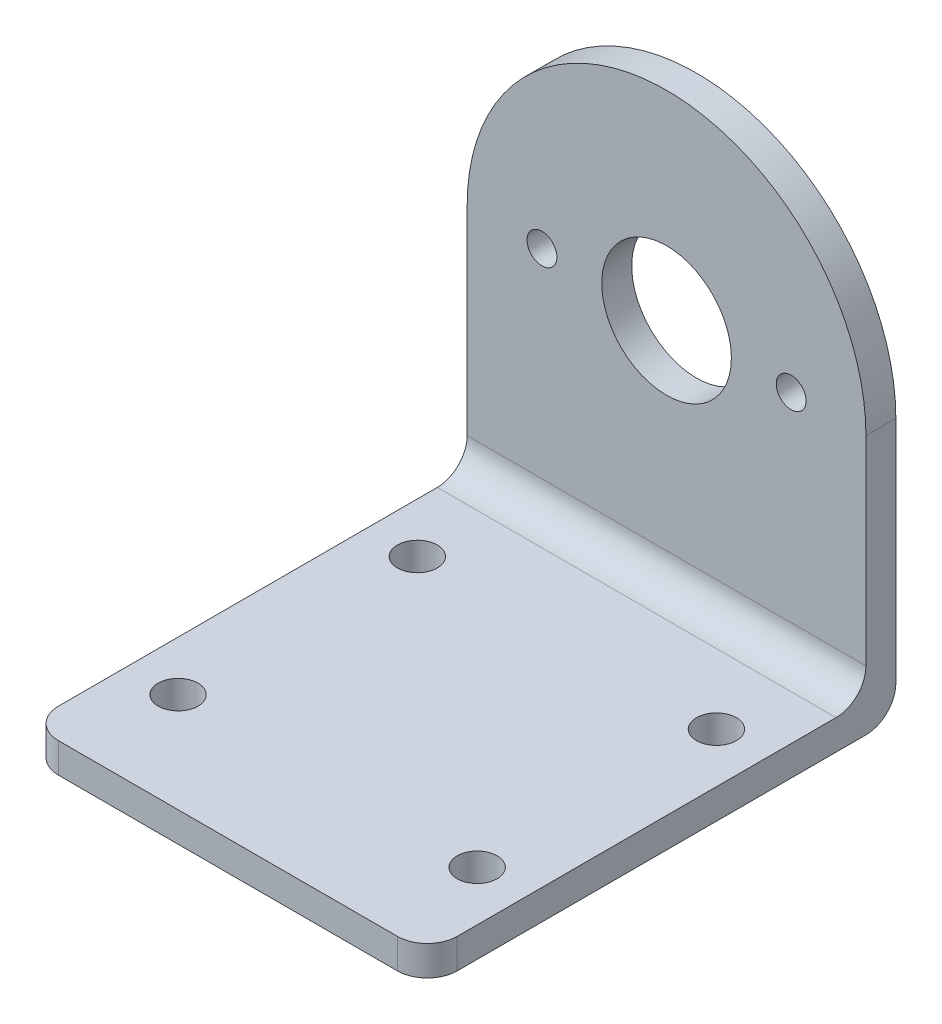
ISO-10303-21;
HEADER;
FILE_DESCRIPTION(('STEP AP214'),'2;1');
FILE_NAME('part.step','',(''),(''),'','','');
FILE_SCHEMA(('AUTOMOTIVE_DESIGN { 1 0 10303 214 1 1 1 1 }'));
ENDSEC;
DATA;
#1=APPLICATION_CONTEXT('core data for automotive mechanical design processes');
#2=APPLICATION_PROTOCOL_DEFINITION('international standard','automotive_design',2000,#1);
#3=PRODUCT_CONTEXT('',#1,'mechanical');
#4=PRODUCT('Part','Part','',(#3));
#5=PRODUCT_RELATED_PRODUCT_CATEGORY('part','',(#4));
#6=PRODUCT_DEFINITION_FORMATION('','',#4);
#7=PRODUCT_DEFINITION_CONTEXT('part definition',#1,'design');
#8=PRODUCT_DEFINITION('design','',#6,#7);
#9=PRODUCT_DEFINITION_SHAPE('','',#8);
#10=(LENGTH_UNIT() NAMED_UNIT(*) SI_UNIT(.MILLI.,.METRE.));
#11=(NAMED_UNIT(*) PLANE_ANGLE_UNIT() SI_UNIT($,.RADIAN.));
#12=(NAMED_UNIT(*) SI_UNIT($,.STERADIAN.) SOLID_ANGLE_UNIT());
#13=UNCERTAINTY_MEASURE_WITH_UNIT(LENGTH_MEASURE(1.E-05),#10,'distance_accuracy_value','');
#14=(GEOMETRIC_REPRESENTATION_CONTEXT(3) GLOBAL_UNCERTAINTY_ASSIGNED_CONTEXT((#13)) GLOBAL_UNIT_ASSIGNED_CONTEXT((#10,
#11,#12)) REPRESENTATION_CONTEXT('',''));
#15=CARTESIAN_POINT('',(0.,0.,0.));
#16=DIRECTION('',(0.,0.,1.));
#17=DIRECTION('',(1.,0.,0.));
#18=AXIS2_PLACEMENT_3D('',#15,#16,#17);
#19=CARTESIAN_POINT('',(20.,26.,3.));
#20=DIRECTION('',(0.,0.,1.));
#21=DIRECTION('',(1.,0.,0.));
#22=AXIS2_PLACEMENT_3D('',#19,#20,#21);
#23=PLANE('',#22);
#24=DIRECTION('',(0.,-1.,0.));
#25=VECTOR('',#24,1.);
#26=CARTESIAN_POINT('',(0.,0.,3.));
#27=LINE('',#26,#25);
#28=CARTESIAN_POINT('',(0.,26.,3.));
#29=VERTEX_POINT('',#28);
#30=CARTESIAN_POINT('',(0.,6.,3.));
#31=VERTEX_POINT('',#30);
#32=EDGE_CURVE('E122',#29,#31,#27,.T.);
#33=ORIENTED_EDGE('',*,*,#32,.T.);
#34=DIRECTION('',(-1.,0.,0.));
#35=VECTOR('',#34,1.);
#36=CARTESIAN_POINT('',(20.,6.,3.));
#37=LINE('',#36,#35);
#38=CARTESIAN_POINT('',(40.,6.,3.));
#39=VERTEX_POINT('',#38);
#40=EDGE_CURVE('E119',#31,#39,#37,.F.);
#41=ORIENTED_EDGE('',*,*,#40,.T.);
#42=DIRECTION('',(0.,1.,0.));
#43=VECTOR('',#42,1.);
#44=CARTESIAN_POINT('',(40.,0.,3.));
#45=LINE('',#44,#43);
#46=CARTESIAN_POINT('',(40.,26.,3.));
#47=VERTEX_POINT('',#46);
#48=EDGE_CURVE('E111',#39,#47,#45,.T.);
#49=ORIENTED_EDGE('',*,*,#48,.T.);
#50=CARTESIAN_POINT('',(20.,26.,3.));
#51=DIRECTION('',(0.,0.,1.));
#52=DIRECTION('',(1.,0.,0.));
#53=AXIS2_PLACEMENT_3D('',#50,#51,#52);
#54=CIRCLE('',#53,20.);
#55=EDGE_CURVE('E116',#47,#29,#54,.T.);
#56=ORIENTED_EDGE('',*,*,#55,.T.);
#57=EDGE_LOOP('',(#33,#41,#49,#56));
#58=FACE_BOUND('',#57,.T.);
#59=CARTESIAN_POINT('',(32.5,26.,3.));
#60=DIRECTION('',(0.,0.,1.));
#61=DIRECTION('',(1.,0.,0.));
#62=AXIS2_PLACEMENT_3D('',#59,#60,#61);
#63=CIRCLE('',#62,1.5);
#64=CARTESIAN_POINT('',(34.,26.,3.));
#65=VERTEX_POINT('',#64);
#66=EDGE_CURVE('E162',#65,#65,#63,.T.);
#67=ORIENTED_EDGE('',*,*,#66,.F.);
#68=EDGE_LOOP('',(#67));
#69=FACE_BOUND('',#68,.T.);
#70=CARTESIAN_POINT('',(20.,26.,3.));
#71=DIRECTION('',(0.,0.,1.));
#72=DIRECTION('',(1.,0.,0.));
#73=AXIS2_PLACEMENT_3D('',#70,#71,#72);
#74=CIRCLE('',#73,6.50000000000001);
#75=CARTESIAN_POINT('',(26.5,26.,3.));
#76=VERTEX_POINT('',#75);
#77=EDGE_CURVE('E146',#76,#76,#74,.T.);
#78=ORIENTED_EDGE('',*,*,#77,.F.);
#79=EDGE_LOOP('',(#78));
#80=FACE_BOUND('',#79,.T.);
#81=CARTESIAN_POINT('',(7.5,26.,3.));
#82=DIRECTION('',(0.,0.,1.));
#83=DIRECTION('',(1.,0.,0.));
#84=AXIS2_PLACEMENT_3D('',#81,#82,#83);
#85=CIRCLE('',#84,1.5);
#86=CARTESIAN_POINT('',(9.,26.,3.));
#87=VERTEX_POINT('',#86);
#88=EDGE_CURVE('E168',#87,#87,#85,.T.);
#89=ORIENTED_EDGE('',*,*,#88,.F.);
#90=EDGE_LOOP('',(#89));
#91=FACE_BOUND('',#90,.T.);
#92=ADVANCED_FACE('F35',(#58,#69,#80,#91),#23,.T.);
#93=CARTESIAN_POINT('',(20.,26.,0.));
#94=DIRECTION('',(0.,0.,1.));
#95=DIRECTION('',(1.,0.,0.));
#96=AXIS2_PLACEMENT_3D('',#93,#94,#95);
#97=PLANE('',#96);
#98=DIRECTION('',(0.,1.,0.));
#99=VECTOR('',#98,1.);
#100=CARTESIAN_POINT('',(40.,0.,0.));
#101=LINE('',#100,#99);
#102=CARTESIAN_POINT('',(40.,3.,0.));
#103=VERTEX_POINT('',#102);
#104=CARTESIAN_POINT('',(40.,26.,0.));
#105=VERTEX_POINT('',#104);
#106=EDGE_CURVE('E128',#103,#105,#101,.T.);
#107=ORIENTED_EDGE('',*,*,#106,.F.);
#108=DIRECTION('',(1.,0.,0.));
#109=VECTOR('',#108,1.);
#110=CARTESIAN_POINT('',(20.,3.,0.));
#111=LINE('',#110,#109);
#112=CARTESIAN_POINT('',(0.,3.,0.));
#113=VERTEX_POINT('',#112);
#114=EDGE_CURVE('E232',#103,#113,#111,.F.);
#115=ORIENTED_EDGE('',*,*,#114,.T.);
#116=DIRECTION('',(0.,-1.,0.));
#117=VECTOR('',#116,1.);
#118=CARTESIAN_POINT('',(0.,0.,0.));
#119=LINE('',#118,#117);
#120=CARTESIAN_POINT('',(0.,26.,0.));
#121=VERTEX_POINT('',#120);
#122=EDGE_CURVE('E143',#121,#113,#119,.T.);
#123=ORIENTED_EDGE('',*,*,#122,.F.);
#124=CARTESIAN_POINT('',(20.,26.,0.));
#125=DIRECTION('',(0.,0.,1.));
#126=DIRECTION('',(1.,0.,0.));
#127=AXIS2_PLACEMENT_3D('',#124,#125,#126);
#128=CIRCLE('',#127,20.);
#129=EDGE_CURVE('E148',#105,#121,#128,.T.);
#130=ORIENTED_EDGE('',*,*,#129,.F.);
#131=EDGE_LOOP('',(#107,#115,#123,#130));
#132=FACE_BOUND('',#131,.T.);
#133=CARTESIAN_POINT('',(20.,26.,0.));
#134=DIRECTION('',(0.,0.,1.));
#135=DIRECTION('',(1.,0.,0.));
#136=AXIS2_PLACEMENT_3D('',#133,#134,#135);
#137=CIRCLE('',#136,6.50000000000001);
#138=CARTESIAN_POINT('',(26.5,26.,0.));
#139=VERTEX_POINT('',#138);
#140=EDGE_CURVE('E159',#139,#139,#137,.T.);
#141=ORIENTED_EDGE('',*,*,#140,.T.);
#142=EDGE_LOOP('',(#141));
#143=FACE_BOUND('',#142,.T.);
#144=CARTESIAN_POINT('',(32.5,26.,0.));
#145=DIRECTION('',(0.,0.,1.));
#146=DIRECTION('',(1.,0.,0.));
#147=AXIS2_PLACEMENT_3D('',#144,#145,#146);
#148=CIRCLE('',#147,1.5);
#149=CARTESIAN_POINT('',(34.,26.,0.));
#150=VERTEX_POINT('',#149);
#151=EDGE_CURVE('E165',#150,#150,#148,.T.);
#152=ORIENTED_EDGE('',*,*,#151,.T.);
#153=EDGE_LOOP('',(#152));
#154=FACE_BOUND('',#153,.T.);
#155=CARTESIAN_POINT('',(7.5,26.,0.));
#156=DIRECTION('',(0.,0.,1.));
#157=DIRECTION('',(1.,0.,0.));
#158=AXIS2_PLACEMENT_3D('',#155,#156,#157);
#159=CIRCLE('',#158,1.5);
#160=CARTESIAN_POINT('',(9.,26.,0.));
#161=VERTEX_POINT('',#160);
#162=EDGE_CURVE('E171',#161,#161,#159,.T.);
#163=ORIENTED_EDGE('',*,*,#162,.T.);
#164=EDGE_LOOP('',(#163));
#165=FACE_BOUND('',#164,.T.);
#166=ADVANCED_FACE('F260',(#132,#143,#154,#165),#97,.F.);
#167=CARTESIAN_POINT('',(0.,0.,3.));
#168=DIRECTION('',(1.,0.,0.));
#169=DIRECTION('',(0.,0.,-1.));
#170=AXIS2_PLACEMENT_3D('',#167,#168,#169);
#171=PLANE('',#170);
#172=DIRECTION('',(0.,0.,-1.));
#173=VECTOR('',#172,1.);
#174=CARTESIAN_POINT('',(0.,0.,3.));
#175=LINE('',#174,#173);
#176=CARTESIAN_POINT('',(0.,0.,44.));
#177=VERTEX_POINT('',#176);
#178=CARTESIAN_POINT('',(0.,0.,3.));
#179=VERTEX_POINT('',#178);
#180=EDGE_CURVE('E151',#177,#179,#175,.T.);
#181=ORIENTED_EDGE('',*,*,#180,.F.);
#182=DIRECTION('',(0.,-1.,0.));
#183=VECTOR('',#182,1.);
#184=CARTESIAN_POINT('',(0.,0.,44.));
#185=LINE('',#184,#183);
#186=CARTESIAN_POINT('',(0.,3.,44.));
#187=VERTEX_POINT('',#186);
#188=EDGE_CURVE('E11',#177,#187,#185,.F.);
#189=ORIENTED_EDGE('',*,*,#188,.T.);
#190=DIRECTION('',(0.,0.,-1.));
#191=VECTOR('',#190,1.);
#192=CARTESIAN_POINT('',(0.,3.,47.));
#193=LINE('',#192,#191);
#194=CARTESIAN_POINT('',(0.,3.,6.));
#195=VERTEX_POINT('',#194);
#196=EDGE_CURVE('E180',#187,#195,#193,.T.);
#197=ORIENTED_EDGE('',*,*,#196,.T.);
#198=CARTESIAN_POINT('',(0.,6.,6.));
#199=DIRECTION('',(1.,0.,0.));
#200=DIRECTION('',(0.,0.,-1.));
#201=AXIS2_PLACEMENT_3D('',#198,#199,#200);
#202=CIRCLE('',#201,3.);
#203=EDGE_CURVE('E213',#195,#31,#202,.T.);
#204=ORIENTED_EDGE('',*,*,#203,.T.);
#205=ORIENTED_EDGE('',*,*,#32,.F.);
#206=DIRECTION('',(0.,0.,-1.));
#207=VECTOR('',#206,1.);
#208=CARTESIAN_POINT('',(0.,26.,3.));
#209=LINE('',#208,#207);
#210=EDGE_CURVE('E132',#29,#121,#209,.T.);
#211=ORIENTED_EDGE('',*,*,#210,.T.);
#212=ORIENTED_EDGE('',*,*,#122,.T.);
#213=CARTESIAN_POINT('',(0.,3.,3.));
#214=DIRECTION('',(1.,0.,0.));
#215=DIRECTION('',(0.,0.,-1.));
#216=AXIS2_PLACEMENT_3D('',#213,#214,#215);
#217=CIRCLE('',#216,3.);
#218=EDGE_CURVE('E210',#113,#179,#217,.F.);
#219=ORIENTED_EDGE('',*,*,#218,.T.);
#220=EDGE_LOOP('',(#181,#189,#197,#204,#205,#211,#212,#219));
#221=FACE_BOUND('',#220,.T.);
#222=ADVANCED_FACE('F265',(#221),#171,.F.);
#223=CARTESIAN_POINT('',(0.,0.,3.));
#224=DIRECTION('',(0.,1.,0.));
#225=DIRECTION('',(0.,0.,1.));
#226=AXIS2_PLACEMENT_3D('',#223,#224,#225);
#227=PLANE('',#226);
#228=CARTESIAN_POINT('',(35.,0.,13.));
#229=DIRECTION('',(0.,-1.,0.));
#230=DIRECTION('',(0.,0.,-1.));
#231=AXIS2_PLACEMENT_3D('',#228,#229,#230);
#232=CIRCLE('',#231,2.);
#233=CARTESIAN_POINT('',(35.,0.,11.));
#234=VERTEX_POINT('',#233);
#235=EDGE_CURVE('E197',#234,#234,#232,.T.);
#236=ORIENTED_EDGE('',*,*,#235,.F.);
#237=EDGE_LOOP('',(#236));
#238=FACE_BOUND('',#237,.T.);
#239=CARTESIAN_POINT('',(5.,0.,13.));
#240=DIRECTION('',(0.,-1.,0.));
#241=DIRECTION('',(0.,0.,-1.));
#242=AXIS2_PLACEMENT_3D('',#239,#240,#241);
#243=CIRCLE('',#242,2.);
#244=CARTESIAN_POINT('',(5.,0.,11.));
#245=VERTEX_POINT('',#244);
#246=EDGE_CURVE('E193',#245,#245,#243,.T.);
#247=ORIENTED_EDGE('',*,*,#246,.F.);
#248=EDGE_LOOP('',(#247));
#249=FACE_BOUND('',#248,.T.);
#250=CARTESIAN_POINT('',(35.,0.,37.));
#251=DIRECTION('',(0.,-1.,0.));
#252=DIRECTION('',(0.,0.,-1.));
#253=AXIS2_PLACEMENT_3D('',#250,#251,#252);
#254=CIRCLE('',#253,2.);
#255=CARTESIAN_POINT('',(35.,0.,35.));
#256=VERTEX_POINT('',#255);
#257=EDGE_CURVE('E189',#256,#256,#254,.T.);
#258=ORIENTED_EDGE('',*,*,#257,.F.);
#259=EDGE_LOOP('',(#258));
#260=FACE_BOUND('',#259,.T.);
#261=CARTESIAN_POINT('',(4.99999999999999,0.,37.));
#262=DIRECTION('',(0.,-1.,0.));
#263=DIRECTION('',(0.,0.,-1.));
#264=AXIS2_PLACEMENT_3D('',#261,#262,#263);
#265=CIRCLE('',#264,2.);
#266=CARTESIAN_POINT('',(4.99999999999999,0.,35.));
#267=VERTEX_POINT('',#266);
#268=EDGE_CURVE('E185',#267,#267,#265,.T.);
#269=ORIENTED_EDGE('',*,*,#268,.F.);
#270=EDGE_LOOP('',(#269));
#271=FACE_BOUND('',#270,.T.);
#272=DIRECTION('',(0.,0.,-1.));
#273=VECTOR('',#272,1.);
#274=CARTESIAN_POINT('',(40.,0.,3.));
#275=LINE('',#274,#273);
#276=CARTESIAN_POINT('',(40.,0.,44.));
#277=VERTEX_POINT('',#276);
#278=CARTESIAN_POINT('',(40.,0.,3.));
#279=VERTEX_POINT('',#278);
#280=EDGE_CURVE('E131',#277,#279,#275,.T.);
#281=ORIENTED_EDGE('',*,*,#280,.F.);
#282=CARTESIAN_POINT('',(37.,0.,44.));
#283=DIRECTION('',(0.,1.,0.));
#284=DIRECTION('',(0.,0.,1.));
#285=AXIS2_PLACEMENT_3D('',#282,#283,#284);
#286=CIRCLE('',#285,3.);
#287=CARTESIAN_POINT('',(37.,0.,47.));
#288=VERTEX_POINT('',#287);
#289=EDGE_CURVE('E43',#277,#288,#286,.F.);
#290=ORIENTED_EDGE('',*,*,#289,.T.);
#291=DIRECTION('',(1.,0.,0.));
#292=VECTOR('',#291,1.);
#293=CARTESIAN_POINT('',(0.,0.,47.));
#294=LINE('',#293,#292);
#295=CARTESIAN_POINT('',(3.,0.,47.));
#296=VERTEX_POINT('',#295);
#297=EDGE_CURVE('E181',#296,#288,#294,.T.);
#298=ORIENTED_EDGE('',*,*,#297,.F.);
#299=CARTESIAN_POINT('',(3.,0.,44.));
#300=DIRECTION('',(0.,1.,0.));
#301=DIRECTION('',(0.,0.,1.));
#302=AXIS2_PLACEMENT_3D('',#299,#300,#301);
#303=CIRCLE('',#302,3.);
#304=EDGE_CURVE('E50',#296,#177,#303,.F.);
#305=ORIENTED_EDGE('',*,*,#304,.T.);
#306=ORIENTED_EDGE('',*,*,#180,.T.);
#307=DIRECTION('',(1.,0.,0.));
#308=VECTOR('',#307,1.);
#309=CARTESIAN_POINT('',(0.,0.,3.));
#310=LINE('',#309,#308);
#311=EDGE_CURVE('E153',#179,#279,#310,.T.);
#312=ORIENTED_EDGE('',*,*,#311,.T.);
#313=EDGE_LOOP('',(#281,#290,#298,#305,#306,#312));
#314=FACE_BOUND('',#313,.T.);
#315=ADVANCED_FACE('F276',(#238,#249,#260,#271,#314),#227,.F.);
#316=CARTESIAN_POINT('',(40.,0.,3.));
#317=DIRECTION('',(-1.,0.,0.));
#318=DIRECTION('',(0.,0.,1.));
#319=AXIS2_PLACEMENT_3D('',#316,#317,#318);
#320=PLANE('',#319);
#321=DIRECTION('',(0.,0.,-1.));
#322=VECTOR('',#321,1.);
#323=CARTESIAN_POINT('',(40.,3.,47.));
#324=LINE('',#323,#322);
#325=CARTESIAN_POINT('',(40.,3.,44.));
#326=VERTEX_POINT('',#325);
#327=CARTESIAN_POINT('',(40.,3.,6.));
#328=VERTEX_POINT('',#327);
#329=EDGE_CURVE('E174',#326,#328,#324,.T.);
#330=ORIENTED_EDGE('',*,*,#329,.F.);
#331=DIRECTION('',(0.,1.,0.));
#332=VECTOR('',#331,1.);
#333=CARTESIAN_POINT('',(40.,0.,44.));
#334=LINE('',#333,#332);
#335=EDGE_CURVE('E58',#326,#277,#334,.F.);
#336=ORIENTED_EDGE('',*,*,#335,.T.);
#337=ORIENTED_EDGE('',*,*,#280,.T.);
#338=CARTESIAN_POINT('',(40.,3.,3.));
#339=DIRECTION('',(-1.,0.,0.));
#340=DIRECTION('',(0.,0.,1.));
#341=AXIS2_PLACEMENT_3D('',#338,#339,#340);
#342=CIRCLE('',#341,3.);
#343=EDGE_CURVE('E230',#279,#103,#342,.F.);
#344=ORIENTED_EDGE('',*,*,#343,.T.);
#345=ORIENTED_EDGE('',*,*,#106,.T.);
#346=DIRECTION('',(0.,0.,-1.));
#347=VECTOR('',#346,1.);
#348=CARTESIAN_POINT('',(40.,26.,3.));
#349=LINE('',#348,#347);
#350=EDGE_CURVE('E125',#47,#105,#349,.T.);
#351=ORIENTED_EDGE('',*,*,#350,.F.);
#352=ORIENTED_EDGE('',*,*,#48,.F.);
#353=CARTESIAN_POINT('',(40.,6.,6.));
#354=DIRECTION('',(-1.,0.,0.));
#355=DIRECTION('',(0.,0.,1.));
#356=AXIS2_PLACEMENT_3D('',#353,#354,#355);
#357=CIRCLE('',#356,3.);
#358=EDGE_CURVE('E215',#39,#328,#357,.T.);
#359=ORIENTED_EDGE('',*,*,#358,.T.);
#360=EDGE_LOOP('',(#330,#336,#337,#344,#345,#351,#352,#359));
#361=FACE_BOUND('',#360,.T.);
#362=ADVANCED_FACE('F126',(#361),#320,.F.);
#363=CARTESIAN_POINT('',(20.,26.,3.));
#364=DIRECTION('',(0.,0.,-1.));
#365=DIRECTION('',(-1.,0.,0.));
#366=AXIS2_PLACEMENT_3D('',#363,#364,#365);
#367=CYLINDRICAL_SURFACE('',#366,20.);
#368=ORIENTED_EDGE('',*,*,#129,.T.);
#369=ORIENTED_EDGE('',*,*,#210,.F.);
#370=ORIENTED_EDGE('',*,*,#55,.F.);
#371=ORIENTED_EDGE('',*,*,#350,.T.);
#372=EDGE_LOOP('',(#368,#369,#370,#371));
#373=FACE_BOUND('',#372,.T.);
#374=ADVANCED_FACE('F134',(#373),#367,.T.);
#375=CARTESIAN_POINT('',(20.,26.,3.));
#376=DIRECTION('',(0.,0.,-1.));
#377=DIRECTION('',(-1.,0.,0.));
#378=AXIS2_PLACEMENT_3D('',#375,#376,#377);
#379=CYLINDRICAL_SURFACE('',#378,6.50000000000001);
#380=ORIENTED_EDGE('',*,*,#77,.T.);
#381=EDGE_LOOP('',(#380));
#382=FACE_BOUND('',#381,.T.);
#383=ORIENTED_EDGE('',*,*,#140,.F.);
#384=EDGE_LOOP('',(#383));
#385=FACE_BOUND('',#384,.T.);
#386=ADVANCED_FACE('F269',(#382,#385),#379,.F.);
#387=CARTESIAN_POINT('',(32.5,26.,3.));
#388=DIRECTION('',(0.,0.,-1.));
#389=DIRECTION('',(-1.,0.,0.));
#390=AXIS2_PLACEMENT_3D('',#387,#388,#389);
#391=CYLINDRICAL_SURFACE('',#390,1.5);
#392=ORIENTED_EDGE('',*,*,#66,.T.);
#393=EDGE_LOOP('',(#392));
#394=FACE_BOUND('',#393,.T.);
#395=ORIENTED_EDGE('',*,*,#151,.F.);
#396=EDGE_LOOP('',(#395));
#397=FACE_BOUND('',#396,.T.);
#398=ADVANCED_FACE('F326',(#394,#397),#391,.F.);
#399=CARTESIAN_POINT('',(7.5,26.,3.));
#400=DIRECTION('',(0.,0.,-1.));
#401=DIRECTION('',(-1.,0.,0.));
#402=AXIS2_PLACEMENT_3D('',#399,#400,#401);
#403=CYLINDRICAL_SURFACE('',#402,1.5);
#404=ORIENTED_EDGE('',*,*,#88,.T.);
#405=EDGE_LOOP('',(#404));
#406=FACE_BOUND('',#405,.T.);
#407=ORIENTED_EDGE('',*,*,#162,.F.);
#408=EDGE_LOOP('',(#407));
#409=FACE_BOUND('',#408,.T.);
#410=ADVANCED_FACE('F324',(#406,#409),#403,.F.);
#411=CARTESIAN_POINT('',(0.,3.,47.));
#412=DIRECTION('',(0.,-1.,0.));
#413=DIRECTION('',(0.,0.,-1.));
#414=AXIS2_PLACEMENT_3D('',#411,#412,#413);
#415=PLANE('',#414);
#416=CARTESIAN_POINT('',(35.,3.,13.));
#417=DIRECTION('',(0.,-1.,0.));
#418=DIRECTION('',(0.,0.,-1.));
#419=AXIS2_PLACEMENT_3D('',#416,#417,#418);
#420=CIRCLE('',#419,2.);
#421=CARTESIAN_POINT('',(35.,3.,11.));
#422=VERTEX_POINT('',#421);
#423=EDGE_CURVE('E196',#422,#422,#420,.T.);
#424=ORIENTED_EDGE('',*,*,#423,.T.);
#425=EDGE_LOOP('',(#424));
#426=FACE_BOUND('',#425,.T.);
#427=CARTESIAN_POINT('',(5.,3.,13.));
#428=DIRECTION('',(0.,-1.,0.));
#429=DIRECTION('',(0.,0.,-1.));
#430=AXIS2_PLACEMENT_3D('',#427,#428,#429);
#431=CIRCLE('',#430,2.);
#432=CARTESIAN_POINT('',(5.,3.,11.));
#433=VERTEX_POINT('',#432);
#434=EDGE_CURVE('E192',#433,#433,#431,.T.);
#435=ORIENTED_EDGE('',*,*,#434,.T.);
#436=EDGE_LOOP('',(#435));
#437=FACE_BOUND('',#436,.T.);
#438=CARTESIAN_POINT('',(35.,3.,37.));
#439=DIRECTION('',(0.,-1.,0.));
#440=DIRECTION('',(0.,0.,-1.));
#441=AXIS2_PLACEMENT_3D('',#438,#439,#440);
#442=CIRCLE('',#441,2.);
#443=CARTESIAN_POINT('',(35.,3.,35.));
#444=VERTEX_POINT('',#443);
#445=EDGE_CURVE('E188',#444,#444,#442,.T.);
#446=ORIENTED_EDGE('',*,*,#445,.T.);
#447=EDGE_LOOP('',(#446));
#448=FACE_BOUND('',#447,.T.);
#449=CARTESIAN_POINT('',(4.99999999999999,3.,37.));
#450=DIRECTION('',(0.,-1.,0.));
#451=DIRECTION('',(0.,0.,-1.));
#452=AXIS2_PLACEMENT_3D('',#449,#450,#451);
#453=CIRCLE('',#452,2.);
#454=CARTESIAN_POINT('',(4.99999999999999,3.,35.));
#455=VERTEX_POINT('',#454);
#456=EDGE_CURVE('E184',#455,#455,#453,.T.);
#457=ORIENTED_EDGE('',*,*,#456,.T.);
#458=EDGE_LOOP('',(#457));
#459=FACE_BOUND('',#458,.T.);
#460=DIRECTION('',(-1.,0.,0.));
#461=VECTOR('',#460,1.);
#462=CARTESIAN_POINT('',(0.,3.,47.));
#463=LINE('',#462,#461);
#464=CARTESIAN_POINT('',(37.,3.,47.));
#465=VERTEX_POINT('',#464);
#466=CARTESIAN_POINT('',(3.,3.,47.));
#467=VERTEX_POINT('',#466);
#468=EDGE_CURVE('E177',#465,#467,#463,.T.);
#469=ORIENTED_EDGE('',*,*,#468,.F.);
#470=CARTESIAN_POINT('',(37.,3.,44.));
#471=DIRECTION('',(0.,-1.,0.));
#472=DIRECTION('',(0.,0.,-1.));
#473=AXIS2_PLACEMENT_3D('',#470,#471,#472);
#474=CIRCLE('',#473,3.);
#475=EDGE_CURVE('E302',#465,#326,#474,.F.);
#476=ORIENTED_EDGE('',*,*,#475,.T.);
#477=ORIENTED_EDGE('',*,*,#329,.T.);
#478=DIRECTION('',(-1.,0.,0.));
#479=VECTOR('',#478,1.);
#480=CARTESIAN_POINT('',(0.,3.,6.));
#481=LINE('',#480,#479);
#482=EDGE_CURVE('E208',#328,#195,#481,.T.);
#483=ORIENTED_EDGE('',*,*,#482,.T.);
#484=ORIENTED_EDGE('',*,*,#196,.F.);
#485=CARTESIAN_POINT('',(3.,3.,44.));
#486=DIRECTION('',(0.,-1.,0.));
#487=DIRECTION('',(0.,0.,-1.));
#488=AXIS2_PLACEMENT_3D('',#485,#486,#487);
#489=CIRCLE('',#488,3.);
#490=EDGE_CURVE('E223',#187,#467,#489,.F.);
#491=ORIENTED_EDGE('',*,*,#490,.T.);
#492=EDGE_LOOP('',(#469,#476,#477,#483,#484,#491));
#493=FACE_BOUND('',#492,.T.);
#494=ADVANCED_FACE('F240',(#426,#437,#448,#459,#493),#415,.F.);
#495=CARTESIAN_POINT('',(0.,0.,47.));
#496=DIRECTION('',(0.,0.,-1.));
#497=DIRECTION('',(-1.,0.,0.));
#498=AXIS2_PLACEMENT_3D('',#495,#496,#497);
#499=PLANE('',#498);
#500=ORIENTED_EDGE('',*,*,#297,.T.);
#501=DIRECTION('',(0.,1.,0.));
#502=VECTOR('',#501,1.);
#503=CARTESIAN_POINT('',(37.,0.,47.));
#504=LINE('',#503,#502);
#505=EDGE_CURVE('E220',#288,#465,#504,.T.);
#506=ORIENTED_EDGE('',*,*,#505,.T.);
#507=ORIENTED_EDGE('',*,*,#468,.T.);
#508=DIRECTION('',(0.,-1.,0.));
#509=VECTOR('',#508,1.);
#510=CARTESIAN_POINT('',(3.,0.,47.));
#511=LINE('',#510,#509);
#512=EDGE_CURVE('E217',#467,#296,#511,.T.);
#513=ORIENTED_EDGE('',*,*,#512,.T.);
#514=EDGE_LOOP('',(#500,#506,#507,#513));
#515=FACE_BOUND('',#514,.T.);
#516=ADVANCED_FACE('F285',(#515),#499,.F.);
#517=CARTESIAN_POINT('',(0.,3.,3.));
#518=DIRECTION('',(1.,0.,0.));
#519=DIRECTION('',(0.,0.,-1.));
#520=AXIS2_PLACEMENT_3D('',#517,#518,#519);
#521=CYLINDRICAL_SURFACE('',#520,3.);
#522=ORIENTED_EDGE('',*,*,#218,.F.);
#523=ORIENTED_EDGE('',*,*,#114,.F.);
#524=ORIENTED_EDGE('',*,*,#343,.F.);
#525=ORIENTED_EDGE('',*,*,#311,.F.);
#526=EDGE_LOOP('',(#522,#523,#524,#525));
#527=FACE_BOUND('',#526,.T.);
#528=ADVANCED_FACE('F256',(#527),#521,.T.);
#529=CARTESIAN_POINT('',(4.99999999999999,46.,37.));
#530=DIRECTION('',(0.,-1.,0.));
#531=DIRECTION('',(0.,0.,-1.));
#532=AXIS2_PLACEMENT_3D('',#529,#530,#531);
#533=CYLINDRICAL_SURFACE('',#532,2.);
#534=ORIENTED_EDGE('',*,*,#268,.T.);
#535=EDGE_LOOP('',(#534));
#536=FACE_BOUND('',#535,.T.);
#537=ORIENTED_EDGE('',*,*,#456,.F.);
#538=EDGE_LOOP('',(#537));
#539=FACE_BOUND('',#538,.T.);
#540=ADVANCED_FACE('F246',(#536,#539),#533,.F.);
#541=CARTESIAN_POINT('',(35.,46.,37.));
#542=DIRECTION('',(0.,-1.,0.));
#543=DIRECTION('',(0.,0.,-1.));
#544=AXIS2_PLACEMENT_3D('',#541,#542,#543);
#545=CYLINDRICAL_SURFACE('',#544,2.);
#546=ORIENTED_EDGE('',*,*,#257,.T.);
#547=EDGE_LOOP('',(#546));
#548=FACE_BOUND('',#547,.T.);
#549=ORIENTED_EDGE('',*,*,#445,.F.);
#550=EDGE_LOOP('',(#549));
#551=FACE_BOUND('',#550,.T.);
#552=ADVANCED_FACE('F243',(#548,#551),#545,.F.);
#553=CARTESIAN_POINT('',(5.,46.,13.));
#554=DIRECTION('',(0.,-1.,0.));
#555=DIRECTION('',(0.,0.,-1.));
#556=AXIS2_PLACEMENT_3D('',#553,#554,#555);
#557=CYLINDRICAL_SURFACE('',#556,2.);
#558=ORIENTED_EDGE('',*,*,#246,.T.);
#559=EDGE_LOOP('',(#558));
#560=FACE_BOUND('',#559,.T.);
#561=ORIENTED_EDGE('',*,*,#434,.F.);
#562=EDGE_LOOP('',(#561));
#563=FACE_BOUND('',#562,.T.);
#564=ADVANCED_FACE('F245',(#560,#563),#557,.F.);
#565=CARTESIAN_POINT('',(35.,46.,13.));
#566=DIRECTION('',(0.,-1.,0.));
#567=DIRECTION('',(0.,0.,-1.));
#568=AXIS2_PLACEMENT_3D('',#565,#566,#567);
#569=CYLINDRICAL_SURFACE('',#568,2.);
#570=ORIENTED_EDGE('',*,*,#235,.T.);
#571=EDGE_LOOP('',(#570));
#572=FACE_BOUND('',#571,.T.);
#573=ORIENTED_EDGE('',*,*,#423,.F.);
#574=EDGE_LOOP('',(#573));
#575=FACE_BOUND('',#574,.T.);
#576=ADVANCED_FACE('F253',(#572,#575),#569,.F.);
#577=CARTESIAN_POINT('',(0.,6.,6.));
#578=DIRECTION('',(-1.,0.,0.));
#579=DIRECTION('',(0.,0.,1.));
#580=AXIS2_PLACEMENT_3D('',#577,#578,#579);
#581=CYLINDRICAL_SURFACE('',#580,3.);
#582=ORIENTED_EDGE('',*,*,#358,.F.);
#583=ORIENTED_EDGE('',*,*,#40,.F.);
#584=ORIENTED_EDGE('',*,*,#203,.F.);
#585=ORIENTED_EDGE('',*,*,#482,.F.);
#586=EDGE_LOOP('',(#582,#583,#584,#585));
#587=FACE_BOUND('',#586,.T.);
#588=ADVANCED_FACE('F287',(#587),#581,.F.);
#589=CARTESIAN_POINT('',(37.,0.,44.));
#590=DIRECTION('',(0.,1.,0.));
#591=DIRECTION('',(0.,0.,1.));
#592=AXIS2_PLACEMENT_3D('',#589,#590,#591);
#593=CYLINDRICAL_SURFACE('',#592,3.);
#594=ORIENTED_EDGE('',*,*,#289,.F.);
#595=ORIENTED_EDGE('',*,*,#335,.F.);
#596=ORIENTED_EDGE('',*,*,#475,.F.);
#597=ORIENTED_EDGE('',*,*,#505,.F.);
#598=EDGE_LOOP('',(#594,#595,#596,#597));
#599=FACE_BOUND('',#598,.T.);
#600=ADVANCED_FACE('F289',(#599),#593,.T.);
#601=CARTESIAN_POINT('',(3.,0.,44.));
#602=DIRECTION('',(0.,-1.,0.));
#603=DIRECTION('',(0.,0.,-1.));
#604=AXIS2_PLACEMENT_3D('',#601,#602,#603);
#605=CYLINDRICAL_SURFACE('',#604,3.);
#606=ORIENTED_EDGE('',*,*,#490,.F.);
#607=ORIENTED_EDGE('',*,*,#188,.F.);
#608=ORIENTED_EDGE('',*,*,#304,.F.);
#609=ORIENTED_EDGE('',*,*,#512,.F.);
#610=EDGE_LOOP('',(#606,#607,#608,#609));
#611=FACE_BOUND('',#610,.T.);
#612=ADVANCED_FACE('F37',(#611),#605,.T.);
#613=CLOSED_SHELL('',(#92,#166,#222,#315,#362,#374,#386,#398,#410,#494,#516,#528,#540,#552,#564,
#576,#588,#600,#612));
#614=MANIFOLD_SOLID_BREP('B2',#613);
#615=ADVANCED_BREP_SHAPE_REPRESENTATION('',(#18,#614),#14);
#616=SHAPE_DEFINITION_REPRESENTATION(#9,#615);
ENDSEC;
END-ISO-10303-21;
